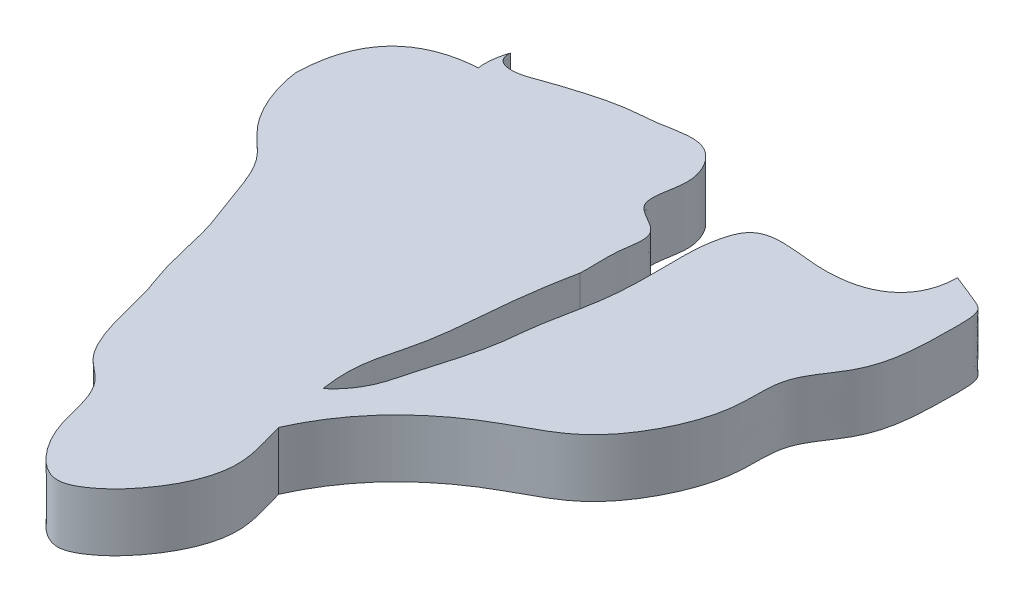
ISO-10303-21;
HEADER;
FILE_DESCRIPTION(('STEP AP214'),'2;1');
FILE_NAME('part.step','',(''),(''),'','','');
FILE_SCHEMA(('AUTOMOTIVE_DESIGN { 1 0 10303 214 1 1 1 1 }'));
ENDSEC;
DATA;
#1=APPLICATION_CONTEXT('core data for automotive mechanical design processes');
#2=APPLICATION_PROTOCOL_DEFINITION('international standard','automotive_design',2000,#1);
#3=PRODUCT_CONTEXT('',#1,'mechanical');
#4=PRODUCT('Part','Part','',(#3));
#5=PRODUCT_RELATED_PRODUCT_CATEGORY('part','',(#4));
#6=PRODUCT_DEFINITION_FORMATION('','',#4);
#7=PRODUCT_DEFINITION_CONTEXT('part definition',#1,'design');
#8=PRODUCT_DEFINITION('design','',#6,#7);
#9=PRODUCT_DEFINITION_SHAPE('','',#8);
#10=(LENGTH_UNIT() NAMED_UNIT(*) SI_UNIT(.MILLI.,.METRE.));
#11=(NAMED_UNIT(*) PLANE_ANGLE_UNIT() SI_UNIT($,.RADIAN.));
#12=(NAMED_UNIT(*) SI_UNIT($,.STERADIAN.) SOLID_ANGLE_UNIT());
#13=UNCERTAINTY_MEASURE_WITH_UNIT(LENGTH_MEASURE(1.E-05),#10,'distance_accuracy_value','');
#14=(GEOMETRIC_REPRESENTATION_CONTEXT(3) GLOBAL_UNCERTAINTY_ASSIGNED_CONTEXT((#13)) GLOBAL_UNIT_ASSIGNED_CONTEXT((#10,
#11,#12)) REPRESENTATION_CONTEXT('',''));
#15=CARTESIAN_POINT('',(0.,0.,0.));
#16=DIRECTION('',(0.,0.,1.));
#17=DIRECTION('',(1.,0.,0.));
#18=AXIS2_PLACEMENT_3D('',#15,#16,#17);
#19=CARTESIAN_POINT('',(24.0375140392618,15.,-145.517039337161));
#20=CARTESIAN_POINT('',(24.6153556133034,15.,-168.822282865869));
#21=CARTESIAN_POINT('',(46.5719716406135,15.,-170.254393226502));
#22=B_SPLINE_CURVE_WITH_KNOTS('',2,(#19,#20,#21),.UNSPECIFIED.,.F.,.F.,(3,3),(0.,1.),.UNSPECIFIED.);
#23=DIRECTION('',(0.,-1.,0.));
#24=VECTOR('',#23,1.);
#25=SURFACE_OF_LINEAR_EXTRUSION('',#22,#24);
#26=CARTESIAN_POINT('',(24.0375140392618,0.,-145.517039337161));
#27=CARTESIAN_POINT('',(24.6153556133034,0.,-168.822282865869));
#28=CARTESIAN_POINT('',(46.5719716406135,0.,-170.254393226502));
#29=B_SPLINE_CURVE_WITH_KNOTS('',2,(#26,#27,#28),.UNSPECIFIED.,.F.,.F.,(3,3),(0.,1.),.UNSPECIFIED.);
#30=CARTESIAN_POINT('',(24.0375140392618,0.,-145.517039337161));
#31=VERTEX_POINT('',#30);
#32=CARTESIAN_POINT('',(46.5719716406135,0.,-170.254393226502));
#33=VERTEX_POINT('',#32);
#34=EDGE_CURVE('E181',#31,#33,#29,.T.);
#35=ORIENTED_EDGE('',*,*,#34,.F.);
#36=DIRECTION('',(0.,-1.,0.));
#37=VECTOR('',#36,1.);
#38=CARTESIAN_POINT('',(24.0375140392618,15.,-145.517039337161));
#39=LINE('',#38,#37);
#40=CARTESIAN_POINT('',(24.0375140392618,15.,-145.517039337161));
#41=VERTEX_POINT('',#40);
#42=EDGE_CURVE('E11',#41,#31,#39,.T.);
#43=ORIENTED_EDGE('',*,*,#42,.F.);
#44=CARTESIAN_POINT('',(46.5719716406135,15.,-170.254393226502));
#45=VERTEX_POINT('',#44);
#46=EDGE_CURVE('E156',#41,#45,#22,.T.);
#47=ORIENTED_EDGE('',*,*,#46,.T.);
#48=DIRECTION('',(0.,-1.,0.));
#49=VECTOR('',#48,1.);
#50=CARTESIAN_POINT('',(46.5719716406135,15.,-170.254393226502));
#51=LINE('',#50,#49);
#52=EDGE_CURVE('E56',#45,#33,#51,.T.);
#53=ORIENTED_EDGE('',*,*,#52,.T.);
#54=EDGE_LOOP('',(#35,#43,#47,#53));
#55=FACE_BOUND('',#54,.T.);
#56=ADVANCED_FACE('F39',(#55),#25,.T.);
#57=CARTESIAN_POINT('',(24.0375140392618,15.,-145.517039337161));
#58=CARTESIAN_POINT('',(24.2621933412284,15.,-143.639002282934));
#59=CARTESIAN_POINT('',(25.4171269550409,15.,-138.134761259731));
#60=CARTESIAN_POINT('',(30.007706348826,15.,-128.35761833204));
#61=CARTESIAN_POINT('',(39.7991492205917,15.,-121.115164183697));
#62=CARTESIAN_POINT('',(43.2128797081711,15.,-110.146291015422));
#63=CARTESIAN_POINT('',(48.6550116352046,15.,-97.0573730260903));
#64=CARTESIAN_POINT('',(49.9672872180633,15.,-86.7279437435889));
#65=CARTESIAN_POINT('',(54.645986214799,15.,-75.4111400507352));
#66=CARTESIAN_POINT('',(57.5935042038401,15.,-57.5488206758712));
#67=CARTESIAN_POINT('',(72.3520359826397,15.,-47.8515999679621));
#68=CARTESIAN_POINT('',(69.1403617110828,15.,-35.8249751369739));
#69=CARTESIAN_POINT('',(82.723997719919,15.,-21.3135393408815));
#70=CARTESIAN_POINT('',(91.4610009765337,15.,-26.0845568898553));
#71=CARTESIAN_POINT('',(99.3599729309818,15.,-34.1459829190389));
#72=CARTESIAN_POINT('',(106.459091673804,15.,-48.0552498706429));
#73=CARTESIAN_POINT('',(101.533602131844,15.,-62.2604950775486));
#74=CARTESIAN_POINT('',(98.8404018994914,15.,-74.4775870626433));
#75=CARTESIAN_POINT('',(96.868182285158,15.,-87.5543523438555));
#76=CARTESIAN_POINT('',(101.802241124934,15.,-102.14324591199));
#77=CARTESIAN_POINT('',(102.790355638582,15.,-119.297508142271));
#78=CARTESIAN_POINT('',(104.336005258598,15.,-130.446896525842));
#79=CARTESIAN_POINT('',(105.753591562007,15.,-137.401839946369));
#80=CARTESIAN_POINT('',(105.757273732984,15.,-137.419894275042));
#81=B_SPLINE_CURVE_WITH_KNOTS('',3,(#57,#58,#59,#60,#61,#62,#63,#64,#65,#66,#67,#68,#69,#70,#71,
#72,#73,#74,#75,#76,#77,#78,#79,#80),.UNSPECIFIED.,.F.,.F.,(4,1,1,1,1,1,1,1,1,1,1,1,1,1,1,1,1,1,
1,1,1,4),(0.0848827910846383,0.107769947600504,0.154078141193935,0.187829052452645,
0.232552432956342,0.26970929217058,0.335228905495779,0.34759696703288,0.388301803040621,
0.400297277197863,0.462463604104336,0.490432200988639,0.503110695907215,0.523547211958244,
0.568461378057781,0.596541231678332,0.621395322375599,0.653634391335673,0.683152646319912,
0.723780599049945,0.766209008009937,0.766319387221955),.UNSPECIFIED.);
#82=DIRECTION('',(0.,-1.,0.));
#83=VECTOR('',#82,1.);
#84=SURFACE_OF_LINEAR_EXTRUSION('',#81,#83);
#85=CARTESIAN_POINT('',(24.0375140392618,0.,-145.517039337161));
#86=CARTESIAN_POINT('',(24.2621933412284,0.,-143.639002282934));
#87=CARTESIAN_POINT('',(25.4171269550409,0.,-138.134761259731));
#88=CARTESIAN_POINT('',(30.007706348826,0.,-128.35761833204));
#89=CARTESIAN_POINT('',(39.7991492205917,0.,-121.115164183697));
#90=CARTESIAN_POINT('',(43.2128797081711,0.,-110.146291015422));
#91=CARTESIAN_POINT('',(48.6550116352046,0.,-97.0573730260903));
#92=CARTESIAN_POINT('',(49.9672872180633,0.,-86.7279437435889));
#93=CARTESIAN_POINT('',(54.645986214799,0.,-75.4111400507352));
#94=CARTESIAN_POINT('',(57.5935042038401,0.,-57.5488206758712));
#95=CARTESIAN_POINT('',(72.3520359826397,0.,-47.8515999679621));
#96=CARTESIAN_POINT('',(69.1403617110828,0.,-35.8249751369739));
#97=CARTESIAN_POINT('',(82.723997719919,0.,-21.3135393408815));
#98=CARTESIAN_POINT('',(91.4610009765337,0.,-26.0845568898553));
#99=CARTESIAN_POINT('',(99.3599729309818,0.,-34.1459829190389));
#100=CARTESIAN_POINT('',(106.459091673804,0.,-48.0552498706429));
#101=CARTESIAN_POINT('',(101.533602131844,0.,-62.2604950775486));
#102=CARTESIAN_POINT('',(98.8404018994914,0.,-74.4775870626433));
#103=CARTESIAN_POINT('',(96.868182285158,0.,-87.5543523438555));
#104=CARTESIAN_POINT('',(101.802241124934,0.,-102.14324591199));
#105=CARTESIAN_POINT('',(102.790355638582,0.,-119.297508142271));
#106=CARTESIAN_POINT('',(104.336005258598,0.,-130.446896525842));
#107=CARTESIAN_POINT('',(105.753591562007,0.,-137.401839946369));
#108=CARTESIAN_POINT('',(105.757273732984,0.,-137.419894275042));
#109=B_SPLINE_CURVE_WITH_KNOTS('',3,(#85,#86,#87,#88,#89,#90,#91,#92,#93,#94,#95,#96,#97,#98,
#99,#100,#101,#102,#103,#104,#105,#106,#107,#108),.UNSPECIFIED.,.F.,.F.,(4,1,1,1,1,1,1,1,1,1,1,
1,1,1,1,1,1,1,1,1,1,4),(0.0848827910846383,0.107769947600504,0.154078141193935,
0.187829052452645,0.232552432956342,0.26970929217058,0.335228905495779,0.34759696703288,
0.388301803040621,0.400297277197863,0.462463604104336,0.490432200988639,0.503110695907215,
0.523547211958244,0.568461378057781,0.596541231678332,0.621395322375599,0.653634391335673,
0.683152646319912,0.723780599049945,0.766209008009937,0.766319387221955),.UNSPECIFIED.);
#110=CARTESIAN_POINT('',(101.354801017919,0.,-63.7793609923405));
#111=VERTEX_POINT('',#110);
#112=EDGE_CURVE('E185',#31,#111,#109,.T.);
#113=ORIENTED_EDGE('',*,*,#112,.T.);
#114=DIRECTION('',(0.,-1.,0.));
#115=VECTOR('',#114,1.);
#116=CARTESIAN_POINT('',(101.354801017919,15.,-63.7793609923405));
#117=LINE('',#116,#115);
#118=CARTESIAN_POINT('',(101.354801017919,15.,-63.7793609923405));
#119=VERTEX_POINT('',#118);
#120=EDGE_CURVE('E48',#119,#111,#117,.T.);
#121=ORIENTED_EDGE('',*,*,#120,.F.);
#122=EDGE_CURVE('E113',#41,#119,#81,.T.);
#123=ORIENTED_EDGE('',*,*,#122,.F.);
#124=ORIENTED_EDGE('',*,*,#42,.T.);
#125=EDGE_LOOP('',(#113,#121,#123,#124));
#126=FACE_BOUND('',#125,.T.);
#127=ADVANCED_FACE('F151',(#126),#84,.F.);
#128=CARTESIAN_POINT('',(101.354801017919,15.,-63.7793609923405));
#129=CARTESIAN_POINT('',(107.117832885505,15.,-76.7216563163484));
#130=CARTESIAN_POINT('',(120.473418612477,15.,-89.8974310437623));
#131=CARTESIAN_POINT('',(142.317546651403,15.,-99.8069097032206));
#132=CARTESIAN_POINT('',(151.763080690088,15.,-112.717182701809));
#133=CARTESIAN_POINT('',(156.680083839088,15.,-127.208081729662));
#134=CARTESIAN_POINT('',(155.026379864244,15.,-140.767224006801));
#135=CARTESIAN_POINT('',(165.947395909332,15.,-153.380172538971));
#136=CARTESIAN_POINT('',(166.472728828723,15.,-165.379777077955));
#137=CARTESIAN_POINT('',(166.475511991308,15.,-181.771898826602));
#138=CARTESIAN_POINT('',(162.7822380195,15.,-182.245817733696));
#139=CARTESIAN_POINT('',(155.713820159323,15.,-185.222032492138));
#140=B_SPLINE_CURVE_WITH_KNOTS('',3,(#128,#129,#130,#131,#132,#133,#134,#135,#136,#137,#138,
#139),.UNSPECIFIED.,.F.,.F.,(4,1,1,1,1,1,1,1,1,4),(0.,0.265263994654648,0.36520821126212,
0.471003714823281,0.575448749921277,0.659468452485632,0.752228068611275,0.920297924576335,
0.960402115518944,1.),.UNSPECIFIED.);
#141=DIRECTION('',(0.,-1.,0.));
#142=VECTOR('',#141,1.);
#143=SURFACE_OF_LINEAR_EXTRUSION('',#140,#142);
#144=CARTESIAN_POINT('',(101.354801017919,0.,-63.7793609923405));
#145=CARTESIAN_POINT('',(107.117832885505,0.,-76.7216563163484));
#146=CARTESIAN_POINT('',(120.473418612477,0.,-89.8974310437623));
#147=CARTESIAN_POINT('',(142.317546651403,0.,-99.8069097032206));
#148=CARTESIAN_POINT('',(151.763080690088,0.,-112.717182701809));
#149=CARTESIAN_POINT('',(156.680083839088,0.,-127.208081729662));
#150=CARTESIAN_POINT('',(155.026379864244,0.,-140.767224006801));
#151=CARTESIAN_POINT('',(165.947395909332,0.,-153.380172538971));
#152=CARTESIAN_POINT('',(166.472728828723,0.,-165.379777077955));
#153=CARTESIAN_POINT('',(166.475511991308,0.,-181.771898826602));
#154=CARTESIAN_POINT('',(162.7822380195,0.,-182.245817733696));
#155=CARTESIAN_POINT('',(155.713820159323,0.,-185.222032492138));
#156=B_SPLINE_CURVE_WITH_KNOTS('',3,(#144,#145,#146,#147,#148,#149,#150,#151,#152,#153,#154,
#155),.UNSPECIFIED.,.F.,.F.,(4,1,1,1,1,1,1,1,1,4),(0.,0.265263994654648,0.36520821126212,
0.471003714823281,0.575448749921277,0.659468452485632,0.752228068611275,0.920297924576335,
0.960402115518944,1.),.UNSPECIFIED.);
#157=CARTESIAN_POINT('',(155.713820159323,0.,-185.222032492138));
#158=VERTEX_POINT('',#157);
#159=EDGE_CURVE('E186',#111,#158,#156,.T.);
#160=ORIENTED_EDGE('',*,*,#159,.T.);
#161=DIRECTION('',(0.,-1.,0.));
#162=VECTOR('',#161,1.);
#163=CARTESIAN_POINT('',(155.713820159323,15.,-185.222032492138));
#164=LINE('',#163,#162);
#165=CARTESIAN_POINT('',(155.713820159323,15.,-185.222032492138));
#166=VERTEX_POINT('',#165);
#167=EDGE_CURVE('E229',#166,#158,#164,.T.);
#168=ORIENTED_EDGE('',*,*,#167,.F.);
#169=EDGE_CURVE('E155',#119,#166,#140,.T.);
#170=ORIENTED_EDGE('',*,*,#169,.F.);
#171=ORIENTED_EDGE('',*,*,#120,.T.);
#172=EDGE_LOOP('',(#160,#168,#170,#171));
#173=FACE_BOUND('',#172,.T.);
#174=ADVANCED_FACE('F169',(#173),#143,.F.);
#175=CARTESIAN_POINT('',(155.713820159323,15.,-185.222032492138));
#176=CARTESIAN_POINT('',(155.425874834643,15.,-173.100712352762));
#177=CARTESIAN_POINT('',(140.483266869337,15.,-166.904105138324));
#178=CARTESIAN_POINT('',(118.936964382744,15.,-172.612470356245));
#179=CARTESIAN_POINT('',(115.192644125411,15.,-160.330308288356));
#180=CARTESIAN_POINT('',(115.348268100144,15.,-149.617652951586));
#181=CARTESIAN_POINT('',(115.444629092176,15.,-134.450964327299));
#182=CARTESIAN_POINT('',(112.04537119914,15.,-122.272000915312));
#183=CARTESIAN_POINT('',(110.825170090525,15.,-106.919954458305));
#184=CARTESIAN_POINT('',(107.256011136673,15.,-97.098479499063));
#185=CARTESIAN_POINT('',(104.287209349977,15.,-85.0571247463461));
#186=CARTESIAN_POINT('',(101.32680142316,15.,-80.6207119310641));
#187=CARTESIAN_POINT('',(98.3711739112684,15.,-78.2317084362458));
#188=B_SPLINE_CURVE_WITH_KNOTS('',3,(#175,#176,#177,#178,#179,#180,#181,#182,#183,#184,#185,
#186,#187),.UNSPECIFIED.,.F.,.F.,(4,1,1,1,1,1,1,1,1,1,4),(0.,0.208504742655187,
0.326502314040696,0.372956542354601,0.455666882521752,0.565002652878199,0.694719851294561,
0.729433596082807,0.891839378018672,0.917522652910268,1.),.UNSPECIFIED.);
#189=DIRECTION('',(0.,-1.,0.));
#190=VECTOR('',#189,1.);
#191=SURFACE_OF_LINEAR_EXTRUSION('',#188,#190);
#192=CARTESIAN_POINT('',(155.713820159323,0.,-185.222032492138));
#193=CARTESIAN_POINT('',(155.425874834643,0.,-173.100712352762));
#194=CARTESIAN_POINT('',(140.483266869337,0.,-166.904105138324));
#195=CARTESIAN_POINT('',(118.936964382744,0.,-172.612470356245));
#196=CARTESIAN_POINT('',(115.192644125411,0.,-160.330308288356));
#197=CARTESIAN_POINT('',(115.348268100144,0.,-149.617652951586));
#198=CARTESIAN_POINT('',(115.444629092176,0.,-134.450964327299));
#199=CARTESIAN_POINT('',(112.04537119914,0.,-122.272000915312));
#200=CARTESIAN_POINT('',(110.825170090525,0.,-106.919954458305));
#201=CARTESIAN_POINT('',(107.256011136673,0.,-97.098479499063));
#202=CARTESIAN_POINT('',(104.287209349977,0.,-85.0571247463461));
#203=CARTESIAN_POINT('',(101.32680142316,0.,-80.6207119310641));
#204=CARTESIAN_POINT('',(98.3711739112684,0.,-78.2317084362458));
#205=B_SPLINE_CURVE_WITH_KNOTS('',3,(#192,#193,#194,#195,#196,#197,#198,#199,#200,#201,#202,
#203,#204),.UNSPECIFIED.,.F.,.F.,(4,1,1,1,1,1,1,1,1,1,4),(0.,0.208504742655187,
0.326502314040696,0.372956542354601,0.455666882521752,0.565002652878199,0.694719851294561,
0.729433596082807,0.891839378018672,0.917522652910268,1.),.UNSPECIFIED.);
#206=CARTESIAN_POINT('',(98.3711739112684,0.,-78.2317084362458));
#207=VERTEX_POINT('',#206);
#208=EDGE_CURVE('E202',#158,#207,#205,.T.);
#209=ORIENTED_EDGE('',*,*,#208,.T.);
#210=DIRECTION('',(0.,-1.,0.));
#211=VECTOR('',#210,1.);
#212=CARTESIAN_POINT('',(98.3711739112684,15.,-78.2317084362458));
#213=LINE('',#212,#211);
#214=CARTESIAN_POINT('',(98.3711739112684,15.,-78.2317084362458));
#215=VERTEX_POINT('',#214);
#216=EDGE_CURVE('E121',#215,#207,#213,.T.);
#217=ORIENTED_EDGE('',*,*,#216,.F.);
#218=EDGE_CURVE('E108',#166,#215,#188,.T.);
#219=ORIENTED_EDGE('',*,*,#218,.F.);
#220=ORIENTED_EDGE('',*,*,#167,.T.);
#221=EDGE_LOOP('',(#209,#217,#219,#220));
#222=FACE_BOUND('',#221,.T.);
#223=ADVANCED_FACE('F150',(#222),#191,.F.);
#224=CARTESIAN_POINT('',(105.757273732984,0.,-137.419894275042));
#225=VERTEX_POINT('',#224);
#226=EDGE_CURVE('E118',#207,#225,#109,.T.);
#227=ORIENTED_EDGE('',*,*,#226,.T.);
#228=DIRECTION('',(0.,-1.,0.));
#229=VECTOR('',#228,1.);
#230=CARTESIAN_POINT('',(105.757273732984,15.,-137.419894275042));
#231=LINE('',#230,#229);
#232=CARTESIAN_POINT('',(105.757273732984,15.,-137.419894275042));
#233=VERTEX_POINT('',#232);
#234=EDGE_CURVE('E115',#233,#225,#231,.T.);
#235=ORIENTED_EDGE('',*,*,#234,.F.);
#236=EDGE_CURVE('E100',#215,#233,#81,.T.);
#237=ORIENTED_EDGE('',*,*,#236,.F.);
#238=ORIENTED_EDGE('',*,*,#216,.T.);
#239=EDGE_LOOP('',(#227,#235,#237,#238));
#240=FACE_BOUND('',#239,.T.);
#241=ADVANCED_FACE('F116',(#240),#84,.F.);
#242=CARTESIAN_POINT('',(47.445167588498,15.,-177.95175500958));
#243=CARTESIAN_POINT('',(47.0253510892153,15.,-174.602758943711));
#244=CARTESIAN_POINT('',(51.7592821933048,15.,-173.341203921857));
#245=CARTESIAN_POINT('',(58.5168000033298,15.,-175.988264579083));
#246=CARTESIAN_POINT('',(66.5294025055738,15.,-178.560886227428));
#247=CARTESIAN_POINT('',(74.6758893928582,15.,-180.591612459629));
#248=CARTESIAN_POINT('',(83.638862203363,15.,-180.930288074213));
#249=CARTESIAN_POINT('',(93.9024394394277,15.,-184.369053507246));
#250=CARTESIAN_POINT('',(101.590112285161,15.,-172.298935736747));
#251=CARTESIAN_POINT('',(95.3587693979354,15.,-160.020471882483));
#252=CARTESIAN_POINT('',(107.883313290671,15.,-156.836055830425));
#253=CARTESIAN_POINT('',(105.171638752526,15.,-146.495919028148));
#254=CARTESIAN_POINT('',(105.945825945678,15.,-141.078138073815));
#255=CARTESIAN_POINT('',(105.757273732984,15.,-137.419894275042));
#256=B_SPLINE_CURVE_WITH_KNOTS('',3,(#242,#243,#244,#245,#246,#247,#248,#249,#250,#251,#252,
#253,#254,#255),.UNSPECIFIED.,.F.,.F.,(4,1,1,1,1,1,1,1,1,1,1,4),(0.,0.0680498849040532,
0.126734754825669,0.221277447388333,0.325872866551354,0.379657996372761,0.499723596851406,
0.610693351389872,0.730784057264137,0.814836596301791,0.893690288383797,1.),.UNSPECIFIED.);
#257=DIRECTION('',(0.,-1.,0.));
#258=VECTOR('',#257,1.);
#259=SURFACE_OF_LINEAR_EXTRUSION('',#256,#258);
#260=CARTESIAN_POINT('',(47.445167588498,0.,-177.95175500958));
#261=CARTESIAN_POINT('',(47.0253510892153,0.,-174.602758943711));
#262=CARTESIAN_POINT('',(51.7592821933048,0.,-173.341203921857));
#263=CARTESIAN_POINT('',(58.5168000033298,0.,-175.988264579083));
#264=CARTESIAN_POINT('',(66.5294025055738,0.,-178.560886227428));
#265=CARTESIAN_POINT('',(74.6758893928582,0.,-180.591612459629));
#266=CARTESIAN_POINT('',(83.638862203363,0.,-180.930288074213));
#267=CARTESIAN_POINT('',(93.9024394394277,0.,-184.369053507246));
#268=CARTESIAN_POINT('',(101.590112285161,0.,-172.298935736747));
#269=CARTESIAN_POINT('',(95.3587693979354,0.,-160.020471882483));
#270=CARTESIAN_POINT('',(107.883313290671,0.,-156.836055830425));
#271=CARTESIAN_POINT('',(105.171638752526,0.,-146.495919028148));
#272=CARTESIAN_POINT('',(105.945825945678,0.,-141.078138073815));
#273=CARTESIAN_POINT('',(105.757273732984,0.,-137.419894275042));
#274=B_SPLINE_CURVE_WITH_KNOTS('',3,(#260,#261,#262,#263,#264,#265,#266,#267,#268,#269,#270,
#271,#272,#273),.UNSPECIFIED.,.F.,.F.,(4,1,1,1,1,1,1,1,1,1,1,4),(0.,0.0680498849040532,
0.126734754825669,0.221277447388333,0.325872866551354,0.379657996372761,0.499723596851406,
0.610693351389872,0.730784057264137,0.814836596301791,0.893690288383797,1.),.UNSPECIFIED.);
#275=CARTESIAN_POINT('',(47.4203754723442,0.,-177.719365278845));
#276=VERTEX_POINT('',#275);
#277=EDGE_CURVE('E209',#276,#225,#274,.T.);
#278=ORIENTED_EDGE('',*,*,#277,.F.);
#279=DIRECTION('',(0.,-1.,0.));
#280=VECTOR('',#279,1.);
#281=CARTESIAN_POINT('',(47.4203754723442,15.,-177.719365278845));
#282=LINE('',#281,#280);
#283=CARTESIAN_POINT('',(47.4203754723442,15.,-177.719365278845));
#284=VERTEX_POINT('',#283);
#285=EDGE_CURVE('E78',#284,#276,#282,.T.);
#286=ORIENTED_EDGE('',*,*,#285,.F.);
#287=EDGE_CURVE('E106',#284,#233,#256,.T.);
#288=ORIENTED_EDGE('',*,*,#287,.T.);
#289=ORIENTED_EDGE('',*,*,#234,.T.);
#290=EDGE_LOOP('',(#278,#286,#288,#289));
#291=FACE_BOUND('',#290,.T.);
#292=ADVANCED_FACE('F123',(#291),#259,.T.);
#293=CARTESIAN_POINT('',(46.5719716406135,15.,-170.254393226502));
#294=CARTESIAN_POINT('',(45.9125632375146,15.,-174.769031776489));
#295=CARTESIAN_POINT('',(48.685902450927,15.,-181.03033137615));
#296=B_SPLINE_CURVE_WITH_KNOTS('',2,(#293,#294,#295),.UNSPECIFIED.,.F.,.F.,(3,3),
(0.88449036683675,1.),.UNSPECIFIED.);
#297=DIRECTION('',(0.,-1.,0.));
#298=VECTOR('',#297,1.);
#299=SURFACE_OF_LINEAR_EXTRUSION('',#296,#298);
#300=CARTESIAN_POINT('',(46.5719716406135,0.,-170.254393226502));
#301=CARTESIAN_POINT('',(45.9125632375146,0.,-174.769031776489));
#302=CARTESIAN_POINT('',(48.685902450927,0.,-181.03033137615));
#303=B_SPLINE_CURVE_WITH_KNOTS('',2,(#300,#301,#302),.UNSPECIFIED.,.F.,.F.,(3,3),
(0.88449036683675,1.),.UNSPECIFIED.);
#304=EDGE_CURVE('E216',#33,#276,#303,.T.);
#305=ORIENTED_EDGE('',*,*,#304,.F.);
#306=ORIENTED_EDGE('',*,*,#52,.F.);
#307=EDGE_CURVE('E124',#45,#284,#296,.T.);
#308=ORIENTED_EDGE('',*,*,#307,.T.);
#309=ORIENTED_EDGE('',*,*,#285,.T.);
#310=EDGE_LOOP('',(#305,#306,#308,#309));
#311=FACE_BOUND('',#310,.T.);
#312=ADVANCED_FACE('F146',(#311),#299,.T.);
#313=CARTESIAN_POINT('',(0.,15.,0.));
#314=DIRECTION('',(0.,1.,0.));
#315=DIRECTION('',(0.,0.,1.));
#316=AXIS2_PLACEMENT_3D('',#313,#314,#315);
#317=PLANE('',#316);
#318=ORIENTED_EDGE('',*,*,#46,.F.);
#319=ORIENTED_EDGE('',*,*,#122,.T.);
#320=ORIENTED_EDGE('',*,*,#169,.T.);
#321=ORIENTED_EDGE('',*,*,#218,.T.);
#322=ORIENTED_EDGE('',*,*,#236,.T.);
#323=ORIENTED_EDGE('',*,*,#287,.F.);
#324=ORIENTED_EDGE('',*,*,#307,.F.);
#325=EDGE_LOOP('',(#318,#319,#320,#321,#322,#323,#324));
#326=FACE_BOUND('',#325,.T.);
#327=ADVANCED_FACE('F103',(#326),#317,.T.);
#328=CARTESIAN_POINT('',(0.,0.,0.));
#329=DIRECTION('',(0.,1.,0.));
#330=DIRECTION('',(0.,0.,1.));
#331=AXIS2_PLACEMENT_3D('',#328,#329,#330);
#332=PLANE('',#331);
#333=ORIENTED_EDGE('',*,*,#34,.T.);
#334=ORIENTED_EDGE('',*,*,#304,.T.);
#335=ORIENTED_EDGE('',*,*,#277,.T.);
#336=ORIENTED_EDGE('',*,*,#226,.F.);
#337=ORIENTED_EDGE('',*,*,#208,.F.);
#338=ORIENTED_EDGE('',*,*,#159,.F.);
#339=ORIENTED_EDGE('',*,*,#112,.F.);
#340=EDGE_LOOP('',(#333,#334,#335,#336,#337,#338,#339));
#341=FACE_BOUND('',#340,.T.);
#342=ADVANCED_FACE('F237',(#341),#332,.F.);
#343=CLOSED_SHELL('',(#56,#127,#174,#223,#241,#292,#312,#327,#342));
#344=MANIFOLD_SOLID_BREP('B2',#343);
#345=ADVANCED_BREP_SHAPE_REPRESENTATION('',(#18,#344),#14);
#346=SHAPE_DEFINITION_REPRESENTATION(#9,#345);
ENDSEC;
END-ISO-10303-21;
